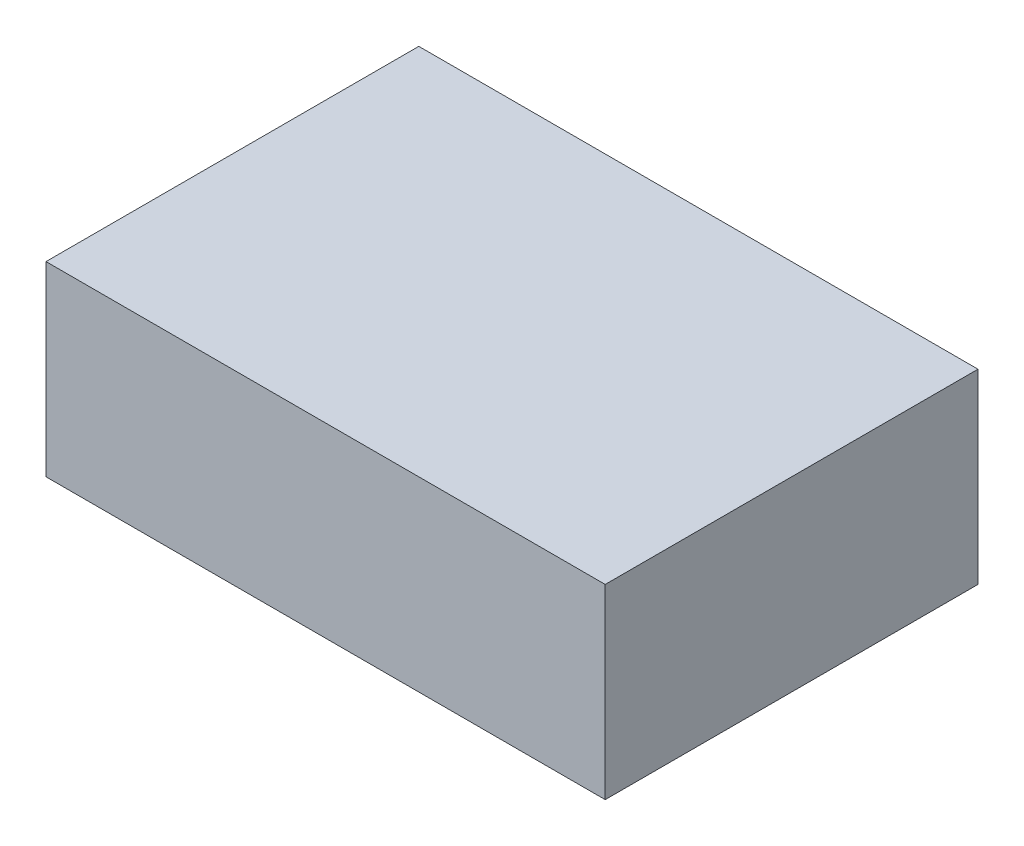
ISO-10303-21;
HEADER;
FILE_DESCRIPTION(('STEP AP214'),'2;1');
FILE_NAME('part.step','',(''),(''),'','','');
FILE_SCHEMA(('AUTOMOTIVE_DESIGN { 1 0 10303 214 1 1 1 1 }'));
ENDSEC;
DATA;
#1=APPLICATION_CONTEXT('core data for automotive mechanical design processes');
#2=APPLICATION_PROTOCOL_DEFINITION('international standard','automotive_design',2000,#1);
#3=PRODUCT_CONTEXT('',#1,'mechanical');
#4=PRODUCT('Part','Part','',(#3));
#5=PRODUCT_RELATED_PRODUCT_CATEGORY('part','',(#4));
#6=PRODUCT_DEFINITION_FORMATION('','',#4);
#7=PRODUCT_DEFINITION_CONTEXT('part definition',#1,'design');
#8=PRODUCT_DEFINITION('design','',#6,#7);
#9=PRODUCT_DEFINITION_SHAPE('','',#8);
#10=(LENGTH_UNIT() NAMED_UNIT(*) SI_UNIT(.MILLI.,.METRE.));
#11=(NAMED_UNIT(*) PLANE_ANGLE_UNIT() SI_UNIT($,.RADIAN.));
#12=(NAMED_UNIT(*) SI_UNIT($,.STERADIAN.) SOLID_ANGLE_UNIT());
#13=UNCERTAINTY_MEASURE_WITH_UNIT(LENGTH_MEASURE(1.E-05),#10,'distance_accuracy_value','');
#14=(GEOMETRIC_REPRESENTATION_CONTEXT(3) GLOBAL_UNCERTAINTY_ASSIGNED_CONTEXT((#13)) GLOBAL_UNIT_ASSIGNED_CONTEXT((#10,
#11,#12)) REPRESENTATION_CONTEXT('',''));
#15=CARTESIAN_POINT('',(0.,0.,0.));
#16=DIRECTION('',(0.,0.,1.));
#17=DIRECTION('',(1.,0.,0.));
#18=AXIS2_PLACEMENT_3D('',#15,#16,#17);
#19=CARTESIAN_POINT('',(0.,68.58,0.));
#20=DIRECTION('',(-1.,0.,0.));
#21=DIRECTION('',(0.,0.,1.));
#22=AXIS2_PLACEMENT_3D('',#19,#20,#21);
#23=PLANE('',#22);
#24=DIRECTION('',(0.,0.,-1.));
#25=VECTOR('',#24,1.);
#26=CARTESIAN_POINT('',(0.,0.,0.));
#27=LINE('',#26,#25);
#28=CARTESIAN_POINT('',(0.,0.,0.));
#29=VERTEX_POINT('',#28);
#30=CARTESIAN_POINT('',(0.,0.,-137.16));
#31=VERTEX_POINT('',#30);
#32=EDGE_CURVE('E102',#29,#31,#27,.T.);
#33=ORIENTED_EDGE('',*,*,#32,.F.);
#34=DIRECTION('',(0.,-1.,0.));
#35=VECTOR('',#34,1.);
#36=CARTESIAN_POINT('',(0.,68.58,0.));
#37=LINE('',#36,#35);
#38=CARTESIAN_POINT('',(0.,68.58,0.));
#39=VERTEX_POINT('',#38);
#40=EDGE_CURVE('E11',#39,#29,#37,.T.);
#41=ORIENTED_EDGE('',*,*,#40,.F.);
#42=DIRECTION('',(0.,0.,-1.));
#43=VECTOR('',#42,1.);
#44=CARTESIAN_POINT('',(0.,68.58,0.));
#45=LINE('',#44,#43);
#46=CARTESIAN_POINT('',(0.,68.58,-137.16));
#47=VERTEX_POINT('',#46);
#48=EDGE_CURVE('E97',#39,#47,#45,.T.);
#49=ORIENTED_EDGE('',*,*,#48,.T.);
#50=DIRECTION('',(0.,-1.,0.));
#51=VECTOR('',#50,1.);
#52=CARTESIAN_POINT('',(0.,68.58,-137.16));
#53=LINE('',#52,#51);
#54=EDGE_CURVE('E40',#47,#31,#53,.T.);
#55=ORIENTED_EDGE('',*,*,#54,.T.);
#56=EDGE_LOOP('',(#33,#41,#49,#55));
#57=FACE_BOUND('',#56,.T.);
#58=ADVANCED_FACE('F37',(#57),#23,.T.);
#59=CARTESIAN_POINT('',(0.,68.58,0.));
#60=DIRECTION('',(0.,0.,-1.));
#61=DIRECTION('',(-1.,0.,0.));
#62=AXIS2_PLACEMENT_3D('',#59,#60,#61);
#63=PLANE('',#62);
#64=DIRECTION('',(1.,0.,0.));
#65=VECTOR('',#64,1.);
#66=CARTESIAN_POINT('',(0.,0.,0.));
#67=LINE('',#66,#65);
#68=CARTESIAN_POINT('',(205.74,0.,0.));
#69=VERTEX_POINT('',#68);
#70=EDGE_CURVE('E70',#29,#69,#67,.T.);
#71=ORIENTED_EDGE('',*,*,#70,.T.);
#72=DIRECTION('',(0.,-1.,0.));
#73=VECTOR('',#72,1.);
#74=CARTESIAN_POINT('',(205.74,68.58,0.));
#75=LINE('',#74,#73);
#76=CARTESIAN_POINT('',(205.74,68.58,0.));
#77=VERTEX_POINT('',#76);
#78=EDGE_CURVE('E46',#77,#69,#75,.T.);
#79=ORIENTED_EDGE('',*,*,#78,.F.);
#80=DIRECTION('',(1.,0.,0.));
#81=VECTOR('',#80,1.);
#82=CARTESIAN_POINT('',(0.,68.58,0.));
#83=LINE('',#82,#81);
#84=EDGE_CURVE('E87',#39,#77,#83,.T.);
#85=ORIENTED_EDGE('',*,*,#84,.F.);
#86=ORIENTED_EDGE('',*,*,#40,.T.);
#87=EDGE_LOOP('',(#71,#79,#85,#86));
#88=FACE_BOUND('',#87,.T.);
#89=ADVANCED_FACE('F112',(#88),#63,.F.);
#90=CARTESIAN_POINT('',(205.74,68.58,0.));
#91=DIRECTION('',(-1.,0.,0.));
#92=DIRECTION('',(0.,0.,1.));
#93=AXIS2_PLACEMENT_3D('',#90,#91,#92);
#94=PLANE('',#93);
#95=DIRECTION('',(0.,0.,-1.));
#96=VECTOR('',#95,1.);
#97=CARTESIAN_POINT('',(205.74,0.,0.));
#98=LINE('',#97,#96);
#99=CARTESIAN_POINT('',(205.74,0.,-137.16));
#100=VERTEX_POINT('',#99);
#101=EDGE_CURVE('E94',#69,#100,#98,.T.);
#102=ORIENTED_EDGE('',*,*,#101,.T.);
#103=DIRECTION('',(0.,-1.,0.));
#104=VECTOR('',#103,1.);
#105=CARTESIAN_POINT('',(205.74,68.58,-137.16));
#106=LINE('',#105,#104);
#107=CARTESIAN_POINT('',(205.74,68.58,-137.16));
#108=VERTEX_POINT('',#107);
#109=EDGE_CURVE('E91',#108,#100,#106,.T.);
#110=ORIENTED_EDGE('',*,*,#109,.F.);
#111=DIRECTION('',(0.,0.,-1.));
#112=VECTOR('',#111,1.);
#113=CARTESIAN_POINT('',(205.74,68.58,0.));
#114=LINE('',#113,#112);
#115=EDGE_CURVE('E82',#77,#108,#114,.T.);
#116=ORIENTED_EDGE('',*,*,#115,.F.);
#117=ORIENTED_EDGE('',*,*,#78,.T.);
#118=EDGE_LOOP('',(#102,#110,#116,#117));
#119=FACE_BOUND('',#118,.T.);
#120=ADVANCED_FACE('F92',(#119),#94,.F.);
#121=CARTESIAN_POINT('',(0.,68.58,-137.16));
#122=DIRECTION('',(0.,0.,-1.));
#123=DIRECTION('',(-1.,0.,0.));
#124=AXIS2_PLACEMENT_3D('',#121,#122,#123);
#125=PLANE('',#124);
#126=DIRECTION('',(1.,0.,0.));
#127=VECTOR('',#126,1.);
#128=CARTESIAN_POINT('',(0.,0.,-137.16));
#129=LINE('',#128,#127);
#130=EDGE_CURVE('E105',#31,#100,#129,.T.);
#131=ORIENTED_EDGE('',*,*,#130,.F.);
#132=ORIENTED_EDGE('',*,*,#54,.F.);
#133=DIRECTION('',(1.,0.,0.));
#134=VECTOR('',#133,1.);
#135=CARTESIAN_POINT('',(0.,68.58,-137.16));
#136=LINE('',#135,#134);
#137=EDGE_CURVE('E86',#47,#108,#136,.T.);
#138=ORIENTED_EDGE('',*,*,#137,.T.);
#139=ORIENTED_EDGE('',*,*,#109,.T.);
#140=EDGE_LOOP('',(#131,#132,#138,#139));
#141=FACE_BOUND('',#140,.T.);
#142=ADVANCED_FACE('F96',(#141),#125,.T.);
#143=CARTESIAN_POINT('',(0.,68.58,0.));
#144=DIRECTION('',(0.,-1.,0.));
#145=DIRECTION('',(0.,0.,-1.));
#146=AXIS2_PLACEMENT_3D('',#143,#144,#145);
#147=PLANE('',#146);
#148=ORIENTED_EDGE('',*,*,#48,.F.);
#149=ORIENTED_EDGE('',*,*,#84,.T.);
#150=ORIENTED_EDGE('',*,*,#115,.T.);
#151=ORIENTED_EDGE('',*,*,#137,.F.);
#152=EDGE_LOOP('',(#148,#149,#150,#151));
#153=FACE_BOUND('',#152,.T.);
#154=ADVANCED_FACE('F85',(#153),#147,.F.);
#155=CARTESIAN_POINT('',(0.,0.,0.));
#156=DIRECTION('',(0.,-1.,0.));
#157=DIRECTION('',(0.,0.,-1.));
#158=AXIS2_PLACEMENT_3D('',#155,#156,#157);
#159=PLANE('',#158);
#160=ORIENTED_EDGE('',*,*,#32,.T.);
#161=ORIENTED_EDGE('',*,*,#130,.T.);
#162=ORIENTED_EDGE('',*,*,#101,.F.);
#163=ORIENTED_EDGE('',*,*,#70,.F.);
#164=EDGE_LOOP('',(#160,#161,#162,#163));
#165=FACE_BOUND('',#164,.T.);
#166=ADVANCED_FACE('F110',(#165),#159,.T.);
#167=CLOSED_SHELL('',(#58,#89,#120,#142,#154,#166));
#168=MANIFOLD_SOLID_BREP('B2',#167);
#169=ADVANCED_BREP_SHAPE_REPRESENTATION('',(#18,#168),#14);
#170=SHAPE_DEFINITION_REPRESENTATION(#9,#169);
ENDSEC;
END-ISO-10303-21;
